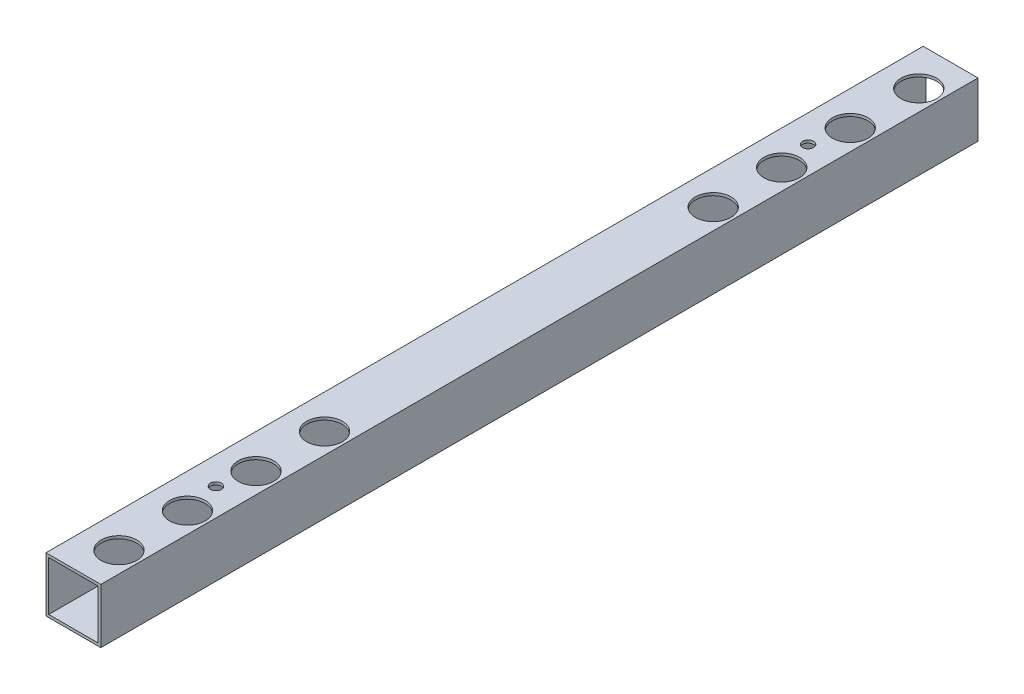
ISO-10303-21;
HEADER;
FILE_DESCRIPTION(('STEP AP214'),'2;1');
FILE_NAME('part.step','',(''),(''),'','','');
FILE_SCHEMA(('AUTOMOTIVE_DESIGN { 1 0 10303 214 1 1 1 1 }'));
ENDSEC;
DATA;
#1=APPLICATION_CONTEXT('core data for automotive mechanical design processes');
#2=APPLICATION_PROTOCOL_DEFINITION('international standard','automotive_design',2000,#1);
#3=PRODUCT_CONTEXT('',#1,'mechanical');
#4=PRODUCT('Part','Part','',(#3));
#5=PRODUCT_RELATED_PRODUCT_CATEGORY('part','',(#4));
#6=PRODUCT_DEFINITION_FORMATION('','',#4);
#7=PRODUCT_DEFINITION_CONTEXT('part definition',#1,'design');
#8=PRODUCT_DEFINITION('design','',#6,#7);
#9=PRODUCT_DEFINITION_SHAPE('','',#8);
#10=(LENGTH_UNIT() NAMED_UNIT(*) SI_UNIT(.MILLI.,.METRE.));
#11=(NAMED_UNIT(*) PLANE_ANGLE_UNIT() SI_UNIT($,.RADIAN.));
#12=(NAMED_UNIT(*) SI_UNIT($,.STERADIAN.) SOLID_ANGLE_UNIT());
#13=UNCERTAINTY_MEASURE_WITH_UNIT(LENGTH_MEASURE(1.E-05),#10,'distance_accuracy_value','');
#14=(GEOMETRIC_REPRESENTATION_CONTEXT(3) GLOBAL_UNCERTAINTY_ASSIGNED_CONTEXT((#13)) GLOBAL_UNIT_ASSIGNED_CONTEXT((#10,
#11,#12)) REPRESENTATION_CONTEXT('',''));
#15=CARTESIAN_POINT('',(0.,0.,0.));
#16=DIRECTION('',(0.,0.,1.));
#17=DIRECTION('',(1.,0.,0.));
#18=AXIS2_PLACEMENT_3D('',#15,#16,#17);
#19=CARTESIAN_POINT('',(10.,-10.,160.));
#20=DIRECTION('',(0.,1.,0.));
#21=DIRECTION('',(0.,0.,1.));
#22=AXIS2_PLACEMENT_3D('',#19,#20,#21);
#23=PLANE('',#22);
#24=CARTESIAN_POINT('',(0.,-10.,-108.));
#25=DIRECTION('',(0.,-1.,0.));
#26=DIRECTION('',(0.,0.,-1.));
#27=AXIS2_PLACEMENT_3D('',#24,#25,#26);
#28=CIRCLE('',#27,2.);
#29=CARTESIAN_POINT('',(0.,-10.,-110.));
#30=VERTEX_POINT('',#29);
#31=EDGE_CURVE('E349',#30,#30,#28,.T.);
#32=ORIENTED_EDGE('',*,*,#31,.F.);
#33=EDGE_LOOP('',(#32));
#34=FACE_BOUND('',#33,.T.);
#35=CARTESIAN_POINT('',(0.,-10.,108.));
#36=DIRECTION('',(0.,-1.,0.));
#37=DIRECTION('',(0.,0.,-1.));
#38=AXIS2_PLACEMENT_3D('',#35,#36,#37);
#39=CIRCLE('',#38,2.);
#40=CARTESIAN_POINT('',(0.,-10.,106.));
#41=VERTEX_POINT('',#40);
#42=EDGE_CURVE('E209',#41,#41,#39,.T.);
#43=ORIENTED_EDGE('',*,*,#42,.F.);
#44=EDGE_LOOP('',(#43));
#45=FACE_BOUND('',#44,.T.);
#46=CARTESIAN_POINT('',(2.5,-10.,95.9));
#47=DIRECTION('',(0.,-1.,0.));
#48=DIRECTION('',(0.,0.,-1.));
#49=AXIS2_PLACEMENT_3D('',#46,#47,#48);
#50=CIRCLE('',#49,2.49999999999999);
#51=CARTESIAN_POINT('',(2.5,-10.,93.4));
#52=VERTEX_POINT('',#51);
#53=EDGE_CURVE('E206',#52,#52,#50,.T.);
#54=ORIENTED_EDGE('',*,*,#53,.F.);
#55=EDGE_LOOP('',(#54));
#56=FACE_BOUND('',#55,.T.);
#57=DIRECTION('',(1.,0.,0.));
#58=VECTOR('',#57,1.);
#59=CARTESIAN_POINT('',(10.,-10.,-160.));
#60=LINE('',#59,#58);
#61=CARTESIAN_POINT('',(-10.,-10.,-160.));
#62=VERTEX_POINT('',#61);
#63=CARTESIAN_POINT('',(10.,-10.,-160.));
#64=VERTEX_POINT('',#63);
#65=EDGE_CURVE('E188',#62,#64,#60,.T.);
#66=ORIENTED_EDGE('',*,*,#65,.T.);
#67=DIRECTION('',(0.,0.,-1.));
#68=VECTOR('',#67,1.);
#69=CARTESIAN_POINT('',(10.,-10.,160.));
#70=LINE('',#69,#68);
#71=CARTESIAN_POINT('',(10.,-10.,160.));
#72=VERTEX_POINT('',#71);
#73=EDGE_CURVE('E46',#72,#64,#70,.T.);
#74=ORIENTED_EDGE('',*,*,#73,.F.);
#75=DIRECTION('',(1.,0.,0.));
#76=VECTOR('',#75,1.);
#77=CARTESIAN_POINT('',(10.,-10.,160.));
#78=LINE('',#77,#76);
#79=CARTESIAN_POINT('',(-10.,-10.,160.));
#80=VERTEX_POINT('',#79);
#81=EDGE_CURVE('E178',#80,#72,#78,.T.);
#82=ORIENTED_EDGE('',*,*,#81,.F.);
#83=DIRECTION('',(0.,0.,-1.));
#84=VECTOR('',#83,1.);
#85=CARTESIAN_POINT('',(-10.,-10.,160.));
#86=LINE('',#85,#84);
#87=EDGE_CURVE('E11',#80,#62,#86,.T.);
#88=ORIENTED_EDGE('',*,*,#87,.T.);
#89=EDGE_LOOP('',(#66,#74,#82,#88));
#90=FACE_BOUND('',#89,.T.);
#91=CARTESIAN_POINT('',(2.5,-10.,-120.9));
#92=DIRECTION('',(0.,-1.,0.));
#93=DIRECTION('',(0.,0.,-1.));
#94=AXIS2_PLACEMENT_3D('',#91,#92,#93);
#95=CIRCLE('',#94,2.49999999999999);
#96=CARTESIAN_POINT('',(2.5,-10.,-123.4));
#97=VERTEX_POINT('',#96);
#98=EDGE_CURVE('E259',#97,#97,#95,.T.);
#99=ORIENTED_EDGE('',*,*,#98,.F.);
#100=EDGE_LOOP('',(#99));
#101=FACE_BOUND('',#100,.T.);
#102=CARTESIAN_POINT('',(2.5,-10.,-145.9));
#103=DIRECTION('',(0.,-1.,0.));
#104=DIRECTION('',(0.,0.,-1.));
#105=AXIS2_PLACEMENT_3D('',#102,#103,#104);
#106=CIRCLE('',#105,2.49999999999999);
#107=CARTESIAN_POINT('',(2.5,-10.,-148.4));
#108=VERTEX_POINT('',#107);
#109=EDGE_CURVE('E253',#108,#108,#106,.T.);
#110=ORIENTED_EDGE('',*,*,#109,.F.);
#111=EDGE_LOOP('',(#110));
#112=FACE_BOUND('',#111,.T.);
#113=CARTESIAN_POINT('',(2.5,-10.,-95.9));
#114=DIRECTION('',(0.,-1.,0.));
#115=DIRECTION('',(0.,0.,-1.));
#116=AXIS2_PLACEMENT_3D('',#113,#114,#115);
#117=CIRCLE('',#116,2.49999999999999);
#118=CARTESIAN_POINT('',(2.5,-10.,-98.4));
#119=VERTEX_POINT('',#118);
#120=EDGE_CURVE('E247',#119,#119,#117,.T.);
#121=ORIENTED_EDGE('',*,*,#120,.F.);
#122=EDGE_LOOP('',(#121));
#123=FACE_BOUND('',#122,.T.);
#124=CARTESIAN_POINT('',(2.5,-10.,-70.9));
#125=DIRECTION('',(0.,-1.,0.));
#126=DIRECTION('',(0.,0.,-1.));
#127=AXIS2_PLACEMENT_3D('',#124,#125,#126);
#128=CIRCLE('',#127,2.49999999999999);
#129=CARTESIAN_POINT('',(2.5,-10.,-73.4));
#130=VERTEX_POINT('',#129);
#131=EDGE_CURVE('E241',#130,#130,#128,.T.);
#132=ORIENTED_EDGE('',*,*,#131,.F.);
#133=EDGE_LOOP('',(#132));
#134=FACE_BOUND('',#133,.T.);
#135=CARTESIAN_POINT('',(2.5,-10.,120.9));
#136=DIRECTION('',(0.,-1.,0.));
#137=DIRECTION('',(0.,0.,-1.));
#138=AXIS2_PLACEMENT_3D('',#135,#136,#137);
#139=CIRCLE('',#138,2.49999999999999);
#140=CARTESIAN_POINT('',(2.5,-10.,118.4));
#141=VERTEX_POINT('',#140);
#142=EDGE_CURVE('E235',#141,#141,#139,.T.);
#143=ORIENTED_EDGE('',*,*,#142,.F.);
#144=EDGE_LOOP('',(#143));
#145=FACE_BOUND('',#144,.T.);
#146=CARTESIAN_POINT('',(2.5,-10.,145.9));
#147=DIRECTION('',(0.,-1.,0.));
#148=DIRECTION('',(0.,0.,-1.));
#149=AXIS2_PLACEMENT_3D('',#146,#147,#148);
#150=CIRCLE('',#149,2.49999999999999);
#151=CARTESIAN_POINT('',(2.5,-10.,143.4));
#152=VERTEX_POINT('',#151);
#153=EDGE_CURVE('E229',#152,#152,#150,.T.);
#154=ORIENTED_EDGE('',*,*,#153,.F.);
#155=EDGE_LOOP('',(#154));
#156=FACE_BOUND('',#155,.T.);
#157=CARTESIAN_POINT('',(2.5,-10.,70.9));
#158=DIRECTION('',(0.,-1.,0.));
#159=DIRECTION('',(0.,0.,-1.));
#160=AXIS2_PLACEMENT_3D('',#157,#158,#159);
#161=CIRCLE('',#160,2.49999999999999);
#162=CARTESIAN_POINT('',(2.5,-10.,68.4));
#163=VERTEX_POINT('',#162);
#164=EDGE_CURVE('E223',#163,#163,#161,.T.);
#165=ORIENTED_EDGE('',*,*,#164,.F.);
#166=EDGE_LOOP('',(#165));
#167=FACE_BOUND('',#166,.T.);
#168=ADVANCED_FACE('F37',(#34,#45,#56,#90,#101,#112,#123,#134,#145,#156,#167),#23,.F.);
#169=CARTESIAN_POINT('',(0.,0.,160.));
#170=DIRECTION('',(0.,0.,-1.));
#171=DIRECTION('',(-1.,0.,0.));
#172=AXIS2_PLACEMENT_3D('',#169,#170,#171);
#173=PLANE('',#172);
#174=DIRECTION('',(0.,-1.,0.));
#175=VECTOR('',#174,1.);
#176=CARTESIAN_POINT('',(-10.,9.99999999999999,160.));
#177=LINE('',#176,#175);
#178=CARTESIAN_POINT('',(-10.,9.99999999999999,160.));
#179=VERTEX_POINT('',#178);
#180=EDGE_CURVE('E175',#179,#80,#177,.T.);
#181=ORIENTED_EDGE('',*,*,#180,.T.);
#182=ORIENTED_EDGE('',*,*,#81,.T.);
#183=DIRECTION('',(0.,1.,0.));
#184=VECTOR('',#183,1.);
#185=CARTESIAN_POINT('',(10.,9.99999999999999,160.));
#186=LINE('',#185,#184);
#187=CARTESIAN_POINT('',(10.,9.99999999999999,160.));
#188=VERTEX_POINT('',#187);
#189=EDGE_CURVE('E181',#72,#188,#186,.T.);
#190=ORIENTED_EDGE('',*,*,#189,.T.);
#191=DIRECTION('',(-1.,0.,0.));
#192=VECTOR('',#191,1.);
#193=CARTESIAN_POINT('',(10.,9.99999999999999,160.));
#194=LINE('',#193,#192);
#195=EDGE_CURVE('E183',#188,#179,#194,.T.);
#196=ORIENTED_EDGE('',*,*,#195,.T.);
#197=EDGE_LOOP('',(#181,#182,#190,#196));
#198=FACE_BOUND('',#197,.T.);
#199=DIRECTION('',(0.,-1.,0.));
#200=VECTOR('',#199,1.);
#201=CARTESIAN_POINT('',(-9.00000000000001,8.99999999999999,160.));
#202=LINE('',#201,#200);
#203=CARTESIAN_POINT('',(-9.00000000000001,8.99999999999999,160.));
#204=VERTEX_POINT('',#203);
#205=CARTESIAN_POINT('',(-9.00000000000001,-9.00000000000001,160.));
#206=VERTEX_POINT('',#205);
#207=EDGE_CURVE('E129',#204,#206,#202,.T.);
#208=ORIENTED_EDGE('',*,*,#207,.F.);
#209=DIRECTION('',(-1.,0.,0.));
#210=VECTOR('',#209,1.);
#211=CARTESIAN_POINT('',(8.99999999999999,9.,160.));
#212=LINE('',#211,#210);
#213=CARTESIAN_POINT('',(8.99999999999999,9.,160.));
#214=VERTEX_POINT('',#213);
#215=EDGE_CURVE('E155',#214,#204,#212,.T.);
#216=ORIENTED_EDGE('',*,*,#215,.F.);
#217=DIRECTION('',(0.,1.,0.));
#218=VECTOR('',#217,1.);
#219=CARTESIAN_POINT('',(8.99999999999999,9.,160.));
#220=LINE('',#219,#218);
#221=CARTESIAN_POINT('',(8.99999999999999,-9.,160.));
#222=VERTEX_POINT('',#221);
#223=EDGE_CURVE('E153',#222,#214,#220,.T.);
#224=ORIENTED_EDGE('',*,*,#223,.F.);
#225=DIRECTION('',(1.,0.,0.));
#226=VECTOR('',#225,1.);
#227=CARTESIAN_POINT('',(8.99999999999999,-9.,160.));
#228=LINE('',#227,#226);
#229=EDGE_CURVE('E139',#206,#222,#228,.T.);
#230=ORIENTED_EDGE('',*,*,#229,.F.);
#231=EDGE_LOOP('',(#208,#216,#224,#230));
#232=FACE_BOUND('',#231,.T.);
#233=ADVANCED_FACE('F151',(#198,#232),#173,.F.);
#234=CARTESIAN_POINT('',(0.,0.,-160.));
#235=DIRECTION('',(0.,0.,-1.));
#236=DIRECTION('',(-1.,0.,0.));
#237=AXIS2_PLACEMENT_3D('',#234,#235,#236);
#238=PLANE('',#237);
#239=DIRECTION('',(0.,-1.,0.));
#240=VECTOR('',#239,1.);
#241=CARTESIAN_POINT('',(-10.,9.99999999999999,-160.));
#242=LINE('',#241,#240);
#243=CARTESIAN_POINT('',(-10.,9.99999999999999,-160.));
#244=VERTEX_POINT('',#243);
#245=EDGE_CURVE('E147',#244,#62,#242,.T.);
#246=ORIENTED_EDGE('',*,*,#245,.F.);
#247=DIRECTION('',(-1.,0.,0.));
#248=VECTOR('',#247,1.);
#249=CARTESIAN_POINT('',(10.,9.99999999999999,-160.));
#250=LINE('',#249,#248);
#251=CARTESIAN_POINT('',(10.,9.99999999999999,-160.));
#252=VERTEX_POINT('',#251);
#253=EDGE_CURVE('E179',#252,#244,#250,.T.);
#254=ORIENTED_EDGE('',*,*,#253,.F.);
#255=DIRECTION('',(0.,1.,0.));
#256=VECTOR('',#255,1.);
#257=CARTESIAN_POINT('',(10.,9.99999999999999,-160.));
#258=LINE('',#257,#256);
#259=EDGE_CURVE('E190',#64,#252,#258,.T.);
#260=ORIENTED_EDGE('',*,*,#259,.F.);
#261=ORIENTED_EDGE('',*,*,#65,.F.);
#262=EDGE_LOOP('',(#246,#254,#260,#261));
#263=FACE_BOUND('',#262,.T.);
#264=DIRECTION('',(-1.,0.,0.));
#265=VECTOR('',#264,1.);
#266=CARTESIAN_POINT('',(8.99999999999999,9.,-160.));
#267=LINE('',#266,#265);
#268=CARTESIAN_POINT('',(8.99999999999999,9.,-160.));
#269=VERTEX_POINT('',#268);
#270=CARTESIAN_POINT('',(-9.00000000000001,8.99999999999999,-160.));
#271=VERTEX_POINT('',#270);
#272=EDGE_CURVE('E140',#269,#271,#267,.T.);
#273=ORIENTED_EDGE('',*,*,#272,.T.);
#274=DIRECTION('',(0.,-1.,0.));
#275=VECTOR('',#274,1.);
#276=CARTESIAN_POINT('',(-9.00000000000001,8.99999999999999,-160.));
#277=LINE('',#276,#275);
#278=CARTESIAN_POINT('',(-9.00000000000001,-9.00000000000001,-160.));
#279=VERTEX_POINT('',#278);
#280=EDGE_CURVE('E160',#271,#279,#277,.T.);
#281=ORIENTED_EDGE('',*,*,#280,.T.);
#282=DIRECTION('',(1.,0.,0.));
#283=VECTOR('',#282,1.);
#284=CARTESIAN_POINT('',(8.99999999999999,-9.,-160.));
#285=LINE('',#284,#283);
#286=CARTESIAN_POINT('',(8.99999999999999,-9.,-160.));
#287=VERTEX_POINT('',#286);
#288=EDGE_CURVE('E146',#279,#287,#285,.T.);
#289=ORIENTED_EDGE('',*,*,#288,.T.);
#290=DIRECTION('',(0.,1.,0.));
#291=VECTOR('',#290,1.);
#292=CARTESIAN_POINT('',(8.99999999999999,9.,-160.));
#293=LINE('',#292,#291);
#294=EDGE_CURVE('E164',#287,#269,#293,.T.);
#295=ORIENTED_EDGE('',*,*,#294,.T.);
#296=EDGE_LOOP('',(#273,#281,#289,#295));
#297=FACE_BOUND('',#296,.T.);
#298=ADVANCED_FACE('F285',(#263,#297),#238,.T.);
#299=CARTESIAN_POINT('',(-10.,9.99999999999999,160.));
#300=DIRECTION('',(1.,0.,0.));
#301=DIRECTION('',(0.,1.,0.));
#302=AXIS2_PLACEMENT_3D('',#299,#300,#301);
#303=PLANE('',#302);
#304=ORIENTED_EDGE('',*,*,#245,.T.);
#305=ORIENTED_EDGE('',*,*,#87,.F.);
#306=ORIENTED_EDGE('',*,*,#180,.F.);
#307=DIRECTION('',(0.,0.,-1.));
#308=VECTOR('',#307,1.);
#309=CARTESIAN_POINT('',(-10.,9.99999999999999,160.));
#310=LINE('',#309,#308);
#311=EDGE_CURVE('E185',#179,#244,#310,.T.);
#312=ORIENTED_EDGE('',*,*,#311,.T.);
#313=EDGE_LOOP('',(#304,#305,#306,#312));
#314=FACE_BOUND('',#313,.T.);
#315=ADVANCED_FACE('F39',(#314),#303,.F.);
#316=CARTESIAN_POINT('',(10.,9.99999999999999,160.));
#317=DIRECTION('',(-1.,0.,0.));
#318=DIRECTION('',(0.,-1.,0.));
#319=AXIS2_PLACEMENT_3D('',#316,#317,#318);
#320=PLANE('',#319);
#321=ORIENTED_EDGE('',*,*,#259,.T.);
#322=DIRECTION('',(0.,0.,-1.));
#323=VECTOR('',#322,1.);
#324=CARTESIAN_POINT('',(10.,9.99999999999999,160.));
#325=LINE('',#324,#323);
#326=EDGE_CURVE('E195',#188,#252,#325,.T.);
#327=ORIENTED_EDGE('',*,*,#326,.F.);
#328=ORIENTED_EDGE('',*,*,#189,.F.);
#329=ORIENTED_EDGE('',*,*,#73,.T.);
#330=EDGE_LOOP('',(#321,#327,#328,#329));
#331=FACE_BOUND('',#330,.T.);
#332=ADVANCED_FACE('F291',(#331),#320,.F.);
#333=CARTESIAN_POINT('',(10.,9.99999999999999,160.));
#334=DIRECTION('',(0.,-1.,0.));
#335=DIRECTION('',(0.,0.,-1.));
#336=AXIS2_PLACEMENT_3D('',#333,#334,#335);
#337=PLANE('',#336);
#338=CARTESIAN_POINT('',(2.5,9.99999999999999,145.9));
#339=DIRECTION('',(0.,-1.,0.));
#340=DIRECTION('',(0.,0.,-1.));
#341=AXIS2_PLACEMENT_3D('',#338,#339,#340);
#342=CIRCLE('',#341,6.5);
#343=CARTESIAN_POINT('',(2.5,9.99999999999999,139.4));
#344=VERTEX_POINT('',#343);
#345=EDGE_CURVE('E441',#344,#344,#342,.T.);
#346=ORIENTED_EDGE('',*,*,#345,.T.);
#347=EDGE_LOOP('',(#346));
#348=FACE_BOUND('',#347,.T.);
#349=CARTESIAN_POINT('',(2.5,9.99999999999999,120.9));
#350=DIRECTION('',(0.,-1.,0.));
#351=DIRECTION('',(0.,0.,-1.));
#352=AXIS2_PLACEMENT_3D('',#349,#350,#351);
#353=CIRCLE('',#352,6.5);
#354=CARTESIAN_POINT('',(2.5,9.99999999999999,114.4));
#355=VERTEX_POINT('',#354);
#356=EDGE_CURVE('E444',#355,#355,#353,.T.);
#357=ORIENTED_EDGE('',*,*,#356,.T.);
#358=EDGE_LOOP('',(#357));
#359=FACE_BOUND('',#358,.T.);
#360=CARTESIAN_POINT('',(2.5,9.99999999999999,95.9));
#361=DIRECTION('',(0.,-1.,0.));
#362=DIRECTION('',(0.,0.,-1.));
#363=AXIS2_PLACEMENT_3D('',#360,#361,#362);
#364=CIRCLE('',#363,6.5);
#365=CARTESIAN_POINT('',(2.5,9.99999999999999,89.4));
#366=VERTEX_POINT('',#365);
#367=EDGE_CURVE('E453',#366,#366,#364,.T.);
#368=ORIENTED_EDGE('',*,*,#367,.T.);
#369=EDGE_LOOP('',(#368));
#370=FACE_BOUND('',#369,.T.);
#371=CARTESIAN_POINT('',(2.5,9.99999999999999,70.9));
#372=DIRECTION('',(0.,-1.,0.));
#373=DIRECTION('',(0.,0.,-1.));
#374=AXIS2_PLACEMENT_3D('',#371,#372,#373);
#375=CIRCLE('',#374,6.5);
#376=CARTESIAN_POINT('',(2.5,9.99999999999999,64.4));
#377=VERTEX_POINT('',#376);
#378=EDGE_CURVE('E459',#377,#377,#375,.T.);
#379=ORIENTED_EDGE('',*,*,#378,.T.);
#380=EDGE_LOOP('',(#379));
#381=FACE_BOUND('',#380,.T.);
#382=CARTESIAN_POINT('',(2.5,9.99999999999999,-145.9));
#383=DIRECTION('',(0.,-1.,0.));
#384=DIRECTION('',(0.,0.,-1.));
#385=AXIS2_PLACEMENT_3D('',#382,#383,#384);
#386=CIRCLE('',#385,6.5);
#387=CARTESIAN_POINT('',(2.5,9.99999999999999,-152.4));
#388=VERTEX_POINT('',#387);
#389=EDGE_CURVE('E331',#388,#388,#386,.T.);
#390=ORIENTED_EDGE('',*,*,#389,.T.);
#391=EDGE_LOOP('',(#390));
#392=FACE_BOUND('',#391,.T.);
#393=CARTESIAN_POINT('',(2.5,9.99999999999999,-120.9));
#394=DIRECTION('',(0.,-1.,0.));
#395=DIRECTION('',(0.,0.,-1.));
#396=AXIS2_PLACEMENT_3D('',#393,#394,#395);
#397=CIRCLE('',#396,6.5);
#398=CARTESIAN_POINT('',(2.5,9.99999999999999,-127.4));
#399=VERTEX_POINT('',#398);
#400=EDGE_CURVE('E330',#399,#399,#397,.T.);
#401=ORIENTED_EDGE('',*,*,#400,.T.);
#402=EDGE_LOOP('',(#401));
#403=FACE_BOUND('',#402,.T.);
#404=CARTESIAN_POINT('',(2.5,9.99999999999999,-95.9));
#405=DIRECTION('',(0.,-1.,0.));
#406=DIRECTION('',(0.,0.,-1.));
#407=AXIS2_PLACEMENT_3D('',#404,#405,#406);
#408=CIRCLE('',#407,6.5);
#409=CARTESIAN_POINT('',(2.5,9.99999999999999,-102.4));
#410=VERTEX_POINT('',#409);
#411=EDGE_CURVE('E341',#410,#410,#408,.T.);
#412=ORIENTED_EDGE('',*,*,#411,.T.);
#413=EDGE_LOOP('',(#412));
#414=FACE_BOUND('',#413,.T.);
#415=CARTESIAN_POINT('',(2.5,9.99999999999999,-70.9));
#416=DIRECTION('',(0.,-1.,0.));
#417=DIRECTION('',(0.,0.,-1.));
#418=AXIS2_PLACEMENT_3D('',#415,#416,#417);
#419=CIRCLE('',#418,6.5);
#420=CARTESIAN_POINT('',(2.5,9.99999999999999,-77.4));
#421=VERTEX_POINT('',#420);
#422=EDGE_CURVE('E346',#421,#421,#419,.T.);
#423=ORIENTED_EDGE('',*,*,#422,.T.);
#424=EDGE_LOOP('',(#423));
#425=FACE_BOUND('',#424,.T.);
#426=CARTESIAN_POINT('',(0.,9.99999999999999,-108.));
#427=DIRECTION('',(0.,-1.,0.));
#428=DIRECTION('',(0.,0.,-1.));
#429=AXIS2_PLACEMENT_3D('',#426,#427,#428);
#430=CIRCLE('',#429,2.);
#431=CARTESIAN_POINT('',(0.,9.99999999999999,-110.));
#432=VERTEX_POINT('',#431);
#433=EDGE_CURVE('E352',#432,#432,#430,.T.);
#434=ORIENTED_EDGE('',*,*,#433,.T.);
#435=EDGE_LOOP('',(#434));
#436=FACE_BOUND('',#435,.T.);
#437=CARTESIAN_POINT('',(0.,9.99999999999999,108.));
#438=DIRECTION('',(0.,-1.,0.));
#439=DIRECTION('',(0.,0.,-1.));
#440=AXIS2_PLACEMENT_3D('',#437,#438,#439);
#441=CIRCLE('',#440,2.);
#442=CARTESIAN_POINT('',(0.,9.99999999999999,106.));
#443=VERTEX_POINT('',#442);
#444=EDGE_CURVE('E202',#443,#443,#441,.T.);
#445=ORIENTED_EDGE('',*,*,#444,.T.);
#446=EDGE_LOOP('',(#445));
#447=FACE_BOUND('',#446,.T.);
#448=ORIENTED_EDGE('',*,*,#253,.T.);
#449=ORIENTED_EDGE('',*,*,#311,.F.);
#450=ORIENTED_EDGE('',*,*,#195,.F.);
#451=ORIENTED_EDGE('',*,*,#326,.T.);
#452=EDGE_LOOP('',(#448,#449,#450,#451));
#453=FACE_BOUND('',#452,.T.);
#454=ADVANCED_FACE('F276',(#348,#359,#370,#381,#392,#403,#414,#425,#436,#447,#453),#337,.F.);
#455=CARTESIAN_POINT('',(-9.00000000000001,8.99999999999999,160.));
#456=DIRECTION('',(1.,0.,0.));
#457=DIRECTION('',(0.,1.,0.));
#458=AXIS2_PLACEMENT_3D('',#455,#456,#457);
#459=PLANE('',#458);
#460=ORIENTED_EDGE('',*,*,#280,.F.);
#461=DIRECTION('',(0.,0.,-1.));
#462=VECTOR('',#461,1.);
#463=CARTESIAN_POINT('',(-9.00000000000001,8.99999999999999,160.));
#464=LINE('',#463,#462);
#465=EDGE_CURVE('E135',#204,#271,#464,.T.);
#466=ORIENTED_EDGE('',*,*,#465,.F.);
#467=ORIENTED_EDGE('',*,*,#207,.T.);
#468=DIRECTION('',(0.,0.,-1.));
#469=VECTOR('',#468,1.);
#470=CARTESIAN_POINT('',(-9.00000000000001,-9.00000000000001,160.));
#471=LINE('',#470,#469);
#472=EDGE_CURVE('E132',#206,#279,#471,.T.);
#473=ORIENTED_EDGE('',*,*,#472,.T.);
#474=EDGE_LOOP('',(#460,#466,#467,#473));
#475=FACE_BOUND('',#474,.T.);
#476=ADVANCED_FACE('F131',(#475),#459,.T.);
#477=CARTESIAN_POINT('',(8.99999999999999,-9.,160.));
#478=DIRECTION('',(0.,1.,0.));
#479=DIRECTION('',(-1.,0.,0.));
#480=AXIS2_PLACEMENT_3D('',#477,#478,#479);
#481=PLANE('',#480);
#482=CARTESIAN_POINT('',(0.,-9.00000000000001,-108.));
#483=DIRECTION('',(0.,1.,0.));
#484=DIRECTION('',(-1.,0.,0.));
#485=AXIS2_PLACEMENT_3D('',#482,#483,#484);
#486=CIRCLE('',#485,2.);
#487=CARTESIAN_POINT('',(-2.00000000000001,-9.00000000000001,-108.));
#488=VERTEX_POINT('',#487);
#489=EDGE_CURVE('E214',#488,#488,#486,.T.);
#490=ORIENTED_EDGE('',*,*,#489,.F.);
#491=EDGE_LOOP('',(#490));
#492=FACE_BOUND('',#491,.T.);
#493=CARTESIAN_POINT('',(0.,-9.00000000000001,108.));
#494=DIRECTION('',(0.,1.,0.));
#495=DIRECTION('',(-1.,0.,0.));
#496=AXIS2_PLACEMENT_3D('',#493,#494,#495);
#497=CIRCLE('',#496,2.);
#498=CARTESIAN_POINT('',(-2.00000000000001,-9.00000000000001,108.));
#499=VERTEX_POINT('',#498);
#500=EDGE_CURVE('E201',#499,#499,#497,.T.);
#501=ORIENTED_EDGE('',*,*,#500,.F.);
#502=EDGE_LOOP('',(#501));
#503=FACE_BOUND('',#502,.T.);
#504=CARTESIAN_POINT('',(2.5,-9.,95.9));
#505=DIRECTION('',(0.,1.,0.));
#506=DIRECTION('',(-1.,0.,0.));
#507=AXIS2_PLACEMENT_3D('',#504,#505,#506);
#508=CIRCLE('',#507,2.49999999999999);
#509=CARTESIAN_POINT('',(0.,-9.,95.9));
#510=VERTEX_POINT('',#509);
#511=EDGE_CURVE('E220',#510,#510,#508,.T.);
#512=ORIENTED_EDGE('',*,*,#511,.F.);
#513=EDGE_LOOP('',(#512));
#514=FACE_BOUND('',#513,.T.);
#515=CARTESIAN_POINT('',(2.5,-9.,70.9));
#516=DIRECTION('',(0.,1.,0.));
#517=DIRECTION('',(-1.,0.,0.));
#518=AXIS2_PLACEMENT_3D('',#515,#516,#517);
#519=CIRCLE('',#518,2.49999999999999);
#520=CARTESIAN_POINT('',(0.,-9.,70.9));
#521=VERTEX_POINT('',#520);
#522=EDGE_CURVE('E226',#521,#521,#519,.T.);
#523=ORIENTED_EDGE('',*,*,#522,.F.);
#524=EDGE_LOOP('',(#523));
#525=FACE_BOUND('',#524,.T.);
#526=CARTESIAN_POINT('',(2.5,-9.,145.9));
#527=DIRECTION('',(0.,1.,0.));
#528=DIRECTION('',(-1.,0.,0.));
#529=AXIS2_PLACEMENT_3D('',#526,#527,#528);
#530=CIRCLE('',#529,2.49999999999999);
#531=CARTESIAN_POINT('',(0.,-9.,145.9));
#532=VERTEX_POINT('',#531);
#533=EDGE_CURVE('E232',#532,#532,#530,.T.);
#534=ORIENTED_EDGE('',*,*,#533,.F.);
#535=EDGE_LOOP('',(#534));
#536=FACE_BOUND('',#535,.T.);
#537=CARTESIAN_POINT('',(2.5,-9.,120.9));
#538=DIRECTION('',(0.,1.,0.));
#539=DIRECTION('',(-1.,0.,0.));
#540=AXIS2_PLACEMENT_3D('',#537,#538,#539);
#541=CIRCLE('',#540,2.49999999999999);
#542=CARTESIAN_POINT('',(0.,-9.,120.9));
#543=VERTEX_POINT('',#542);
#544=EDGE_CURVE('E238',#543,#543,#541,.T.);
#545=ORIENTED_EDGE('',*,*,#544,.F.);
#546=EDGE_LOOP('',(#545));
#547=FACE_BOUND('',#546,.T.);
#548=CARTESIAN_POINT('',(2.5,-9.,-70.9));
#549=DIRECTION('',(0.,1.,0.));
#550=DIRECTION('',(-1.,0.,0.));
#551=AXIS2_PLACEMENT_3D('',#548,#549,#550);
#552=CIRCLE('',#551,2.49999999999999);
#553=CARTESIAN_POINT('',(0.,-9.,-70.9));
#554=VERTEX_POINT('',#553);
#555=EDGE_CURVE('E244',#554,#554,#552,.T.);
#556=ORIENTED_EDGE('',*,*,#555,.F.);
#557=EDGE_LOOP('',(#556));
#558=FACE_BOUND('',#557,.T.);
#559=CARTESIAN_POINT('',(2.5,-9.,-95.9));
#560=DIRECTION('',(0.,1.,0.));
#561=DIRECTION('',(-1.,0.,0.));
#562=AXIS2_PLACEMENT_3D('',#559,#560,#561);
#563=CIRCLE('',#562,2.49999999999999);
#564=CARTESIAN_POINT('',(0.,-9.,-95.9));
#565=VERTEX_POINT('',#564);
#566=EDGE_CURVE('E250',#565,#565,#563,.T.);
#567=ORIENTED_EDGE('',*,*,#566,.F.);
#568=EDGE_LOOP('',(#567));
#569=FACE_BOUND('',#568,.T.);
#570=CARTESIAN_POINT('',(2.5,-9.,-145.9));
#571=DIRECTION('',(0.,1.,0.));
#572=DIRECTION('',(-1.,0.,0.));
#573=AXIS2_PLACEMENT_3D('',#570,#571,#572);
#574=CIRCLE('',#573,2.49999999999999);
#575=CARTESIAN_POINT('',(0.,-9.,-145.9));
#576=VERTEX_POINT('',#575);
#577=EDGE_CURVE('E256',#576,#576,#574,.T.);
#578=ORIENTED_EDGE('',*,*,#577,.F.);
#579=EDGE_LOOP('',(#578));
#580=FACE_BOUND('',#579,.T.);
#581=CARTESIAN_POINT('',(2.5,-9.,-120.9));
#582=DIRECTION('',(0.,1.,0.));
#583=DIRECTION('',(-1.,0.,0.));
#584=AXIS2_PLACEMENT_3D('',#581,#582,#583);
#585=CIRCLE('',#584,2.49999999999999);
#586=CARTESIAN_POINT('',(0.,-9.,-120.9));
#587=VERTEX_POINT('',#586);
#588=EDGE_CURVE('E162',#587,#587,#585,.T.);
#589=ORIENTED_EDGE('',*,*,#588,.F.);
#590=EDGE_LOOP('',(#589));
#591=FACE_BOUND('',#590,.T.);
#592=ORIENTED_EDGE('',*,*,#288,.F.);
#593=ORIENTED_EDGE('',*,*,#472,.F.);
#594=ORIENTED_EDGE('',*,*,#229,.T.);
#595=DIRECTION('',(0.,0.,-1.));
#596=VECTOR('',#595,1.);
#597=CARTESIAN_POINT('',(8.99999999999999,-9.,160.));
#598=LINE('',#597,#596);
#599=EDGE_CURVE('E148',#222,#287,#598,.T.);
#600=ORIENTED_EDGE('',*,*,#599,.T.);
#601=EDGE_LOOP('',(#592,#593,#594,#600));
#602=FACE_BOUND('',#601,.T.);
#603=ADVANCED_FACE('F143',(#492,#503,#514,#525,#536,#547,#558,#569,#580,#591,#602),#481,.T.);
#604=CARTESIAN_POINT('',(8.99999999999999,9.,160.));
#605=DIRECTION('',(-1.,0.,0.));
#606=DIRECTION('',(0.,-1.,0.));
#607=AXIS2_PLACEMENT_3D('',#604,#605,#606);
#608=PLANE('',#607);
#609=ORIENTED_EDGE('',*,*,#294,.F.);
#610=ORIENTED_EDGE('',*,*,#599,.F.);
#611=ORIENTED_EDGE('',*,*,#223,.T.);
#612=DIRECTION('',(0.,0.,-1.));
#613=VECTOR('',#612,1.);
#614=CARTESIAN_POINT('',(8.99999999999999,9.,160.));
#615=LINE('',#614,#613);
#616=CARTESIAN_POINT('',(8.99999999999999,9.,145.9));
#617=VERTEX_POINT('',#616);
#618=EDGE_CURVE('E171',#214,#617,#615,.T.);
#619=ORIENTED_EDGE('',*,*,#618,.T.);
#620=CARTESIAN_POINT('',(8.99999999999999,9.,120.9));
#621=VERTEX_POINT('',#620);
#622=EDGE_CURVE('E59',#617,#621,#615,.T.);
#623=ORIENTED_EDGE('',*,*,#622,.T.);
#624=CARTESIAN_POINT('',(8.99999999999999,9.,95.9));
#625=VERTEX_POINT('',#624);
#626=EDGE_CURVE('E322',#621,#625,#615,.T.);
#627=ORIENTED_EDGE('',*,*,#626,.T.);
#628=CARTESIAN_POINT('',(8.99999999999999,9.,70.9));
#629=VERTEX_POINT('',#628);
#630=EDGE_CURVE('E318',#625,#629,#615,.T.);
#631=ORIENTED_EDGE('',*,*,#630,.T.);
#632=CARTESIAN_POINT('',(8.99999999999999,9.,-70.9));
#633=VERTEX_POINT('',#632);
#634=EDGE_CURVE('E316',#629,#633,#615,.T.);
#635=ORIENTED_EDGE('',*,*,#634,.T.);
#636=CARTESIAN_POINT('',(8.99999999999999,9.,-95.9));
#637=VERTEX_POINT('',#636);
#638=EDGE_CURVE('E173',#633,#637,#615,.T.);
#639=ORIENTED_EDGE('',*,*,#638,.T.);
#640=CARTESIAN_POINT('',(8.99999999999999,9.,-120.9));
#641=VERTEX_POINT('',#640);
#642=EDGE_CURVE('E317',#637,#641,#615,.T.);
#643=ORIENTED_EDGE('',*,*,#642,.T.);
#644=CARTESIAN_POINT('',(8.99999999999999,9.,-145.9));
#645=VERTEX_POINT('',#644);
#646=EDGE_CURVE('E315',#641,#645,#615,.T.);
#647=ORIENTED_EDGE('',*,*,#646,.T.);
#648=EDGE_CURVE('E170',#645,#269,#615,.T.);
#649=ORIENTED_EDGE('',*,*,#648,.T.);
#650=EDGE_LOOP('',(#609,#610,#611,#619,#623,#627,#631,#635,#639,#643,#647,#649));
#651=FACE_BOUND('',#650,.T.);
#652=ADVANCED_FACE('F267',(#651),#608,.T.);
#653=CARTESIAN_POINT('',(8.99999999999999,9.,160.));
#654=DIRECTION('',(0.,-1.,0.));
#655=DIRECTION('',(1.,0.,0.));
#656=AXIS2_PLACEMENT_3D('',#653,#654,#655);
#657=PLANE('',#656);
#658=CARTESIAN_POINT('',(0.,9.,-108.));
#659=DIRECTION('',(0.,-1.,0.));
#660=DIRECTION('',(1.,0.,0.));
#661=AXIS2_PLACEMENT_3D('',#658,#659,#660);
#662=CIRCLE('',#661,2.);
#663=CARTESIAN_POINT('',(1.99999999999999,9.,-108.));
#664=VERTEX_POINT('',#663);
#665=EDGE_CURVE('E41',#664,#664,#662,.T.);
#666=ORIENTED_EDGE('',*,*,#665,.F.);
#667=EDGE_LOOP('',(#666));
#668=FACE_BOUND('',#667,.T.);
#669=CARTESIAN_POINT('',(0.,9.,108.));
#670=DIRECTION('',(0.,-1.,0.));
#671=DIRECTION('',(1.,0.,0.));
#672=AXIS2_PLACEMENT_3D('',#669,#670,#671);
#673=CIRCLE('',#672,2.);
#674=CARTESIAN_POINT('',(1.99999999999999,9.,108.));
#675=VERTEX_POINT('',#674);
#676=EDGE_CURVE('E199',#675,#675,#673,.T.);
#677=ORIENTED_EDGE('',*,*,#676,.F.);
#678=EDGE_LOOP('',(#677));
#679=FACE_BOUND('',#678,.T.);
#680=ORIENTED_EDGE('',*,*,#622,.F.);
#681=CARTESIAN_POINT('',(2.5,9.,145.9));
#682=DIRECTION('',(0.,-1.,0.));
#683=DIRECTION('',(0.,0.,-1.));
#684=AXIS2_PLACEMENT_3D('',#681,#682,#683);
#685=CIRCLE('',#684,6.5);
#686=EDGE_CURVE('E52',#617,#617,#685,.T.);
#687=ORIENTED_EDGE('',*,*,#686,.F.);
#688=ORIENTED_EDGE('',*,*,#618,.F.);
#689=ORIENTED_EDGE('',*,*,#215,.T.);
#690=ORIENTED_EDGE('',*,*,#465,.T.);
#691=ORIENTED_EDGE('',*,*,#272,.F.);
#692=ORIENTED_EDGE('',*,*,#648,.F.);
#693=CARTESIAN_POINT('',(2.5,9.,-145.9));
#694=DIRECTION('',(0.,-1.,0.));
#695=DIRECTION('',(0.,0.,-1.));
#696=AXIS2_PLACEMENT_3D('',#693,#694,#695);
#697=CIRCLE('',#696,6.5);
#698=EDGE_CURVE('E336',#645,#645,#697,.T.);
#699=ORIENTED_EDGE('',*,*,#698,.F.);
#700=ORIENTED_EDGE('',*,*,#646,.F.);
#701=CARTESIAN_POINT('',(2.5,9.,-120.9));
#702=DIRECTION('',(0.,-1.,0.));
#703=DIRECTION('',(0.,0.,-1.));
#704=AXIS2_PLACEMENT_3D('',#701,#702,#703);
#705=CIRCLE('',#704,6.5);
#706=EDGE_CURVE('E328',#641,#641,#705,.T.);
#707=ORIENTED_EDGE('',*,*,#706,.F.);
#708=ORIENTED_EDGE('',*,*,#642,.F.);
#709=CARTESIAN_POINT('',(2.5,9.,-95.9));
#710=DIRECTION('',(0.,-1.,0.));
#711=DIRECTION('',(0.,0.,-1.));
#712=AXIS2_PLACEMENT_3D('',#709,#710,#711);
#713=CIRCLE('',#712,6.5);
#714=EDGE_CURVE('E327',#637,#637,#713,.T.);
#715=ORIENTED_EDGE('',*,*,#714,.F.);
#716=ORIENTED_EDGE('',*,*,#638,.F.);
#717=CARTESIAN_POINT('',(2.5,9.,-70.9));
#718=DIRECTION('',(0.,-1.,0.));
#719=DIRECTION('',(0.,0.,-1.));
#720=AXIS2_PLACEMENT_3D('',#717,#718,#719);
#721=CIRCLE('',#720,6.5);
#722=EDGE_CURVE('E344',#633,#633,#721,.T.);
#723=ORIENTED_EDGE('',*,*,#722,.F.);
#724=ORIENTED_EDGE('',*,*,#634,.F.);
#725=CARTESIAN_POINT('',(2.5,9.,70.9));
#726=DIRECTION('',(0.,-1.,0.));
#727=DIRECTION('',(0.,0.,-1.));
#728=AXIS2_PLACEMENT_3D('',#725,#726,#727);
#729=CIRCLE('',#728,6.5);
#730=EDGE_CURVE('E456',#629,#629,#729,.T.);
#731=ORIENTED_EDGE('',*,*,#730,.F.);
#732=ORIENTED_EDGE('',*,*,#630,.F.);
#733=CARTESIAN_POINT('',(2.5,9.,95.9));
#734=DIRECTION('',(0.,-1.,0.));
#735=DIRECTION('',(0.,0.,-1.));
#736=AXIS2_PLACEMENT_3D('',#733,#734,#735);
#737=CIRCLE('',#736,6.5);
#738=EDGE_CURVE('E450',#625,#625,#737,.T.);
#739=ORIENTED_EDGE('',*,*,#738,.F.);
#740=ORIENTED_EDGE('',*,*,#626,.F.);
#741=CARTESIAN_POINT('',(2.5,9.,120.9));
#742=DIRECTION('',(0.,-1.,0.));
#743=DIRECTION('',(0.,0.,-1.));
#744=AXIS2_PLACEMENT_3D('',#741,#742,#743);
#745=CIRCLE('',#744,6.5);
#746=EDGE_CURVE('E442',#621,#621,#745,.T.);
#747=ORIENTED_EDGE('',*,*,#746,.F.);
#748=EDGE_LOOP('',(#680,#687,#688,#689,#690,#691,#692,#699,#700,#707,#708,#715,#716,#723,#724,
#731,#732,#739,#740,#747));
#749=FACE_BOUND('',#748,.T.);
#750=ADVANCED_FACE('F274',(#668,#679,#749),#657,.T.);
#751=CARTESIAN_POINT('',(2.5,-10.,-120.9));
#752=DIRECTION('',(0.,-1.,0.));
#753=DIRECTION('',(0.,0.,-1.));
#754=AXIS2_PLACEMENT_3D('',#751,#752,#753);
#755=CYLINDRICAL_SURFACE('',#754,2.49999999999999);
#756=ORIENTED_EDGE('',*,*,#98,.T.);
#757=EDGE_LOOP('',(#756));
#758=FACE_BOUND('',#757,.T.);
#759=ORIENTED_EDGE('',*,*,#588,.T.);
#760=EDGE_LOOP('',(#759));
#761=FACE_BOUND('',#760,.T.);
#762=ADVANCED_FACE('F264',(#758,#761),#755,.F.);
#763=CARTESIAN_POINT('',(2.5,-10.,-145.9));
#764=DIRECTION('',(0.,-1.,0.));
#765=DIRECTION('',(0.,0.,-1.));
#766=AXIS2_PLACEMENT_3D('',#763,#764,#765);
#767=CYLINDRICAL_SURFACE('',#766,2.49999999999999);
#768=ORIENTED_EDGE('',*,*,#109,.T.);
#769=EDGE_LOOP('',(#768));
#770=FACE_BOUND('',#769,.T.);
#771=ORIENTED_EDGE('',*,*,#577,.T.);
#772=EDGE_LOOP('',(#771));
#773=FACE_BOUND('',#772,.T.);
#774=ADVANCED_FACE('F368',(#770,#773),#767,.F.);
#775=CARTESIAN_POINT('',(2.5,-10.,-95.9));
#776=DIRECTION('',(0.,-1.,0.));
#777=DIRECTION('',(0.,0.,-1.));
#778=AXIS2_PLACEMENT_3D('',#775,#776,#777);
#779=CYLINDRICAL_SURFACE('',#778,2.49999999999999);
#780=ORIENTED_EDGE('',*,*,#120,.T.);
#781=EDGE_LOOP('',(#780));
#782=FACE_BOUND('',#781,.T.);
#783=ORIENTED_EDGE('',*,*,#566,.T.);
#784=EDGE_LOOP('',(#783));
#785=FACE_BOUND('',#784,.T.);
#786=ADVANCED_FACE('F374',(#782,#785),#779,.F.);
#787=CARTESIAN_POINT('',(2.5,-10.,-70.9));
#788=DIRECTION('',(0.,-1.,0.));
#789=DIRECTION('',(0.,0.,-1.));
#790=AXIS2_PLACEMENT_3D('',#787,#788,#789);
#791=CYLINDRICAL_SURFACE('',#790,2.49999999999999);
#792=ORIENTED_EDGE('',*,*,#131,.T.);
#793=EDGE_LOOP('',(#792));
#794=FACE_BOUND('',#793,.T.);
#795=ORIENTED_EDGE('',*,*,#555,.T.);
#796=EDGE_LOOP('',(#795));
#797=FACE_BOUND('',#796,.T.);
#798=ADVANCED_FACE('F378',(#794,#797),#791,.F.);
#799=CARTESIAN_POINT('',(2.5,-10.,120.9));
#800=DIRECTION('',(0.,-1.,0.));
#801=DIRECTION('',(0.,0.,-1.));
#802=AXIS2_PLACEMENT_3D('',#799,#800,#801);
#803=CYLINDRICAL_SURFACE('',#802,2.49999999999999);
#804=ORIENTED_EDGE('',*,*,#142,.T.);
#805=EDGE_LOOP('',(#804));
#806=FACE_BOUND('',#805,.T.);
#807=ORIENTED_EDGE('',*,*,#544,.T.);
#808=EDGE_LOOP('',(#807));
#809=FACE_BOUND('',#808,.T.);
#810=ADVANCED_FACE('F382',(#806,#809),#803,.F.);
#811=CARTESIAN_POINT('',(2.5,-10.,145.9));
#812=DIRECTION('',(0.,-1.,0.));
#813=DIRECTION('',(0.,0.,-1.));
#814=AXIS2_PLACEMENT_3D('',#811,#812,#813);
#815=CYLINDRICAL_SURFACE('',#814,2.49999999999999);
#816=ORIENTED_EDGE('',*,*,#153,.T.);
#817=EDGE_LOOP('',(#816));
#818=FACE_BOUND('',#817,.T.);
#819=ORIENTED_EDGE('',*,*,#533,.T.);
#820=EDGE_LOOP('',(#819));
#821=FACE_BOUND('',#820,.T.);
#822=ADVANCED_FACE('F386',(#818,#821),#815,.F.);
#823=CARTESIAN_POINT('',(2.5,-10.,70.9));
#824=DIRECTION('',(0.,-1.,0.));
#825=DIRECTION('',(0.,0.,-1.));
#826=AXIS2_PLACEMENT_3D('',#823,#824,#825);
#827=CYLINDRICAL_SURFACE('',#826,2.49999999999999);
#828=ORIENTED_EDGE('',*,*,#164,.T.);
#829=EDGE_LOOP('',(#828));
#830=FACE_BOUND('',#829,.T.);
#831=ORIENTED_EDGE('',*,*,#522,.T.);
#832=EDGE_LOOP('',(#831));
#833=FACE_BOUND('',#832,.T.);
#834=ADVANCED_FACE('F390',(#830,#833),#827,.F.);
#835=CARTESIAN_POINT('',(2.5,-10.,95.9));
#836=DIRECTION('',(0.,-1.,0.));
#837=DIRECTION('',(0.,0.,-1.));
#838=AXIS2_PLACEMENT_3D('',#835,#836,#837);
#839=CYLINDRICAL_SURFACE('',#838,2.49999999999999);
#840=ORIENTED_EDGE('',*,*,#53,.T.);
#841=EDGE_LOOP('',(#840));
#842=FACE_BOUND('',#841,.T.);
#843=ORIENTED_EDGE('',*,*,#511,.T.);
#844=EDGE_LOOP('',(#843));
#845=FACE_BOUND('',#844,.T.);
#846=ADVANCED_FACE('F394',(#842,#845),#839,.F.);
#847=CARTESIAN_POINT('',(0.,-10.,108.));
#848=DIRECTION('',(0.,-1.,0.));
#849=DIRECTION('',(0.,0.,-1.));
#850=AXIS2_PLACEMENT_3D('',#847,#848,#849);
#851=CYLINDRICAL_SURFACE('',#850,2.);
#852=ORIENTED_EDGE('',*,*,#676,.T.);
#853=EDGE_LOOP('',(#852));
#854=FACE_BOUND('',#853,.T.);
#855=ORIENTED_EDGE('',*,*,#444,.F.);
#856=EDGE_LOOP('',(#855));
#857=FACE_BOUND('',#856,.T.);
#858=ADVANCED_FACE('F398',(#854,#857),#851,.F.);
#859=ORIENTED_EDGE('',*,*,#500,.T.);
#860=EDGE_LOOP('',(#859));
#861=FACE_BOUND('',#860,.T.);
#862=ORIENTED_EDGE('',*,*,#42,.T.);
#863=EDGE_LOOP('',(#862));
#864=FACE_BOUND('',#863,.T.);
#865=ADVANCED_FACE('F402',(#861,#864),#851,.F.);
#866=CARTESIAN_POINT('',(0.,-10.,-108.));
#867=DIRECTION('',(0.,-1.,0.));
#868=DIRECTION('',(0.,0.,-1.));
#869=AXIS2_PLACEMENT_3D('',#866,#867,#868);
#870=CYLINDRICAL_SURFACE('',#869,2.);
#871=ORIENTED_EDGE('',*,*,#665,.T.);
#872=EDGE_LOOP('',(#871));
#873=FACE_BOUND('',#872,.T.);
#874=ORIENTED_EDGE('',*,*,#433,.F.);
#875=EDGE_LOOP('',(#874));
#876=FACE_BOUND('',#875,.T.);
#877=ADVANCED_FACE('F359',(#873,#876),#870,.F.);
#878=ORIENTED_EDGE('',*,*,#489,.T.);
#879=EDGE_LOOP('',(#878));
#880=FACE_BOUND('',#879,.T.);
#881=ORIENTED_EDGE('',*,*,#31,.T.);
#882=EDGE_LOOP('',(#881));
#883=FACE_BOUND('',#882,.T.);
#884=ADVANCED_FACE('F405',(#880,#883),#870,.F.);
#885=CARTESIAN_POINT('',(2.5,9.,-70.9));
#886=DIRECTION('',(0.,-1.,0.));
#887=DIRECTION('',(0.,0.,-1.));
#888=AXIS2_PLACEMENT_3D('',#885,#886,#887);
#889=CYLINDRICAL_SURFACE('',#888,6.5);
#890=ORIENTED_EDGE('',*,*,#422,.F.);
#891=EDGE_LOOP('',(#890));
#892=FACE_BOUND('',#891,.T.);
#893=ORIENTED_EDGE('',*,*,#722,.T.);
#894=EDGE_LOOP('',(#893));
#895=FACE_BOUND('',#894,.T.);
#896=ADVANCED_FACE('F406',(#892,#895),#889,.F.);
#897=CARTESIAN_POINT('',(2.5,9.,-95.9));
#898=DIRECTION('',(0.,-1.,0.));
#899=DIRECTION('',(0.,0.,-1.));
#900=AXIS2_PLACEMENT_3D('',#897,#898,#899);
#901=CYLINDRICAL_SURFACE('',#900,6.5);
#902=ORIENTED_EDGE('',*,*,#411,.F.);
#903=EDGE_LOOP('',(#902));
#904=FACE_BOUND('',#903,.T.);
#905=ORIENTED_EDGE('',*,*,#714,.T.);
#906=EDGE_LOOP('',(#905));
#907=FACE_BOUND('',#906,.T.);
#908=ADVANCED_FACE('F409',(#904,#907),#901,.F.);
#909=CARTESIAN_POINT('',(2.5,9.,-120.9));
#910=DIRECTION('',(0.,-1.,0.));
#911=DIRECTION('',(0.,0.,-1.));
#912=AXIS2_PLACEMENT_3D('',#909,#910,#911);
#913=CYLINDRICAL_SURFACE('',#912,6.5);
#914=ORIENTED_EDGE('',*,*,#400,.F.);
#915=EDGE_LOOP('',(#914));
#916=FACE_BOUND('',#915,.T.);
#917=ORIENTED_EDGE('',*,*,#706,.T.);
#918=EDGE_LOOP('',(#917));
#919=FACE_BOUND('',#918,.T.);
#920=ADVANCED_FACE('F413',(#916,#919),#913,.F.);
#921=CARTESIAN_POINT('',(2.5,9.,-145.9));
#922=DIRECTION('',(0.,-1.,0.));
#923=DIRECTION('',(0.,0.,-1.));
#924=AXIS2_PLACEMENT_3D('',#921,#922,#923);
#925=CYLINDRICAL_SURFACE('',#924,6.5);
#926=ORIENTED_EDGE('',*,*,#389,.F.);
#927=EDGE_LOOP('',(#926));
#928=FACE_BOUND('',#927,.T.);
#929=ORIENTED_EDGE('',*,*,#698,.T.);
#930=EDGE_LOOP('',(#929));
#931=FACE_BOUND('',#930,.T.);
#932=ADVANCED_FACE('F417',(#928,#931),#925,.F.);
#933=CARTESIAN_POINT('',(2.5,9.,70.9));
#934=DIRECTION('',(0.,-1.,0.));
#935=DIRECTION('',(0.,0.,-1.));
#936=AXIS2_PLACEMENT_3D('',#933,#934,#935);
#937=CYLINDRICAL_SURFACE('',#936,6.5);
#938=ORIENTED_EDGE('',*,*,#378,.F.);
#939=EDGE_LOOP('',(#938));
#940=FACE_BOUND('',#939,.T.);
#941=ORIENTED_EDGE('',*,*,#730,.T.);
#942=EDGE_LOOP('',(#941));
#943=FACE_BOUND('',#942,.T.);
#944=ADVANCED_FACE('F421',(#940,#943),#937,.F.);
#945=CARTESIAN_POINT('',(2.5,9.,95.9));
#946=DIRECTION('',(0.,-1.,0.));
#947=DIRECTION('',(0.,0.,-1.));
#948=AXIS2_PLACEMENT_3D('',#945,#946,#947);
#949=CYLINDRICAL_SURFACE('',#948,6.5);
#950=ORIENTED_EDGE('',*,*,#367,.F.);
#951=EDGE_LOOP('',(#950));
#952=FACE_BOUND('',#951,.T.);
#953=ORIENTED_EDGE('',*,*,#738,.T.);
#954=EDGE_LOOP('',(#953));
#955=FACE_BOUND('',#954,.T.);
#956=ADVANCED_FACE('F425',(#952,#955),#949,.F.);
#957=CARTESIAN_POINT('',(2.5,9.,120.9));
#958=DIRECTION('',(0.,-1.,0.));
#959=DIRECTION('',(0.,0.,-1.));
#960=AXIS2_PLACEMENT_3D('',#957,#958,#959);
#961=CYLINDRICAL_SURFACE('',#960,6.5);
#962=ORIENTED_EDGE('',*,*,#356,.F.);
#963=EDGE_LOOP('',(#962));
#964=FACE_BOUND('',#963,.T.);
#965=ORIENTED_EDGE('',*,*,#746,.T.);
#966=EDGE_LOOP('',(#965));
#967=FACE_BOUND('',#966,.T.);
#968=ADVANCED_FACE('F429',(#964,#967),#961,.F.);
#969=CARTESIAN_POINT('',(2.5,9.,145.9));
#970=DIRECTION('',(0.,-1.,0.));
#971=DIRECTION('',(0.,0.,-1.));
#972=AXIS2_PLACEMENT_3D('',#969,#970,#971);
#973=CYLINDRICAL_SURFACE('',#972,6.5);
#974=ORIENTED_EDGE('',*,*,#345,.F.);
#975=EDGE_LOOP('',(#974));
#976=FACE_BOUND('',#975,.T.);
#977=ORIENTED_EDGE('',*,*,#686,.T.);
#978=EDGE_LOOP('',(#977));
#979=FACE_BOUND('',#978,.T.);
#980=ADVANCED_FACE('F433',(#976,#979),#973,.F.);
#981=CLOSED_SHELL('',(#168,#233,#298,#315,#332,#454,#476,#603,#652,#750,#762,#774,#786,#798,
#810,#822,#834,#846,#858,#865,#877,#884,#896,#908,#920,#932,#944,#956,#968,#980));
#982=MANIFOLD_SOLID_BREP('B2',#981);
#983=ADVANCED_BREP_SHAPE_REPRESENTATION('',(#18,#982),#14);
#984=SHAPE_DEFINITION_REPRESENTATION(#9,#983);
ENDSEC;
END-ISO-10303-21;
